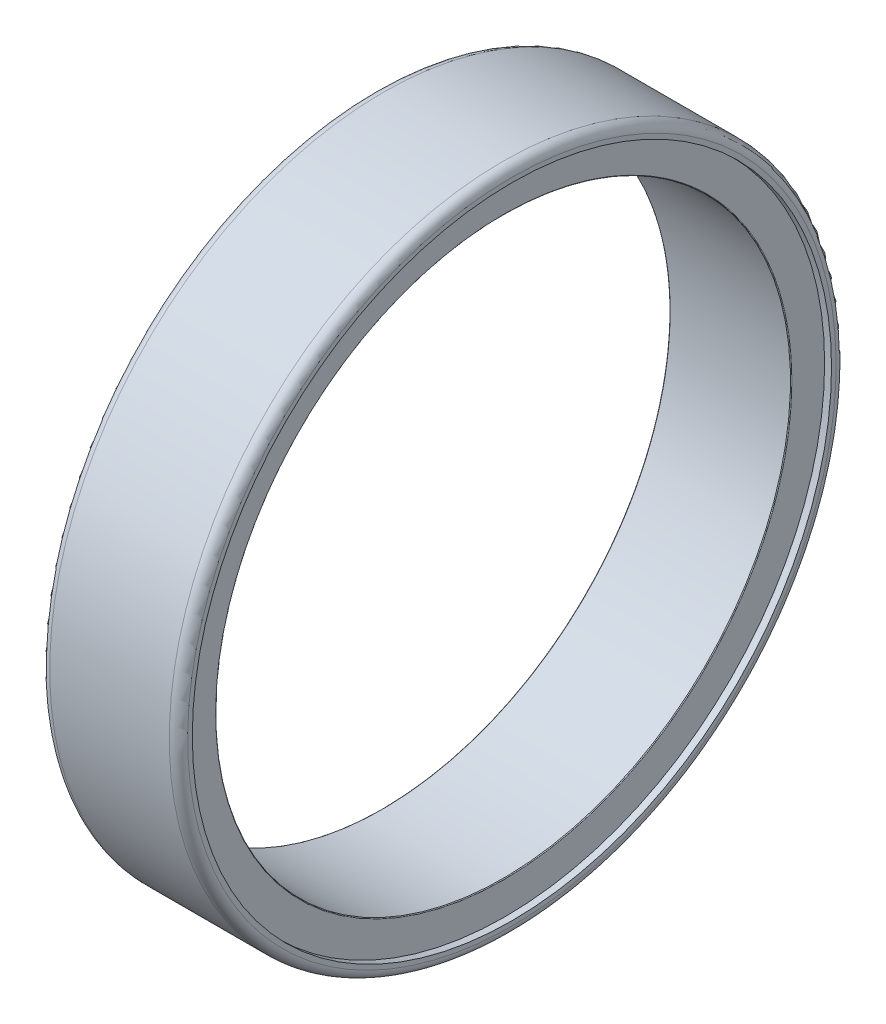
ISO-10303-21;
HEADER;
FILE_DESCRIPTION(('STEP AP214'),'2;1');
FILE_NAME('part.step','',(''),(''),'','','');
FILE_SCHEMA(('AUTOMOTIVE_DESIGN { 1 0 10303 214 1 1 1 1 }'));
ENDSEC;
DATA;
#1=APPLICATION_CONTEXT('core data for automotive mechanical design processes');
#2=APPLICATION_PROTOCOL_DEFINITION('international standard','automotive_design',2000,#1);
#3=PRODUCT_CONTEXT('',#1,'mechanical');
#4=PRODUCT('Part','Part','',(#3));
#5=PRODUCT_RELATED_PRODUCT_CATEGORY('part','',(#4));
#6=PRODUCT_DEFINITION_FORMATION('','',#4);
#7=PRODUCT_DEFINITION_CONTEXT('part definition',#1,'design');
#8=PRODUCT_DEFINITION('design','',#6,#7);
#9=PRODUCT_DEFINITION_SHAPE('','',#8);
#10=(LENGTH_UNIT() NAMED_UNIT(*) SI_UNIT(.MILLI.,.METRE.));
#11=(NAMED_UNIT(*) PLANE_ANGLE_UNIT() SI_UNIT($,.RADIAN.));
#12=(NAMED_UNIT(*) SI_UNIT($,.STERADIAN.) SOLID_ANGLE_UNIT());
#13=UNCERTAINTY_MEASURE_WITH_UNIT(LENGTH_MEASURE(1.E-05),#10,'distance_accuracy_value','');
#14=(GEOMETRIC_REPRESENTATION_CONTEXT(3) GLOBAL_UNCERTAINTY_ASSIGNED_CONTEXT((#13)) GLOBAL_UNIT_ASSIGNED_CONTEXT((#10,
#11,#12)) REPRESENTATION_CONTEXT('',''));
#15=CARTESIAN_POINT('',(0.,0.,0.));
#16=DIRECTION('',(0.,0.,1.));
#17=DIRECTION('',(1.,0.,0.));
#18=AXIS2_PLACEMENT_3D('',#15,#16,#17);
#19=CARTESIAN_POINT('',(-31.75,-1.06966278920977E-13,0.));
#20=DIRECTION('',(1.,0.,0.));
#21=DIRECTION('',(0.,1.,0.));
#22=AXIS2_PLACEMENT_3D('',#19,#20,#21);
#23=CYLINDRICAL_SURFACE('',#22,28.2);
#24=CARTESIAN_POINT('',(5.40000000000006,0.,0.));
#25=DIRECTION('',(1.,0.,0.));
#26=DIRECTION('',(0.,1.,0.));
#27=AXIS2_PLACEMENT_3D('',#24,#25,#26);
#28=CIRCLE('',#27,28.2000000000001);
#29=CARTESIAN_POINT('',(5.40000000000001,28.2,0.));
#30=VERTEX_POINT('',#29);
#31=EDGE_CURVE('E66',#30,#30,#28,.T.);
#32=ORIENTED_EDGE('',*,*,#31,.T.);
#33=EDGE_LOOP('',(#32));
#34=FACE_BOUND('',#33,.T.);
#35=CARTESIAN_POINT('',(5.23925120224264,0.,0.));
#36=DIRECTION('',(-1.,0.,0.));
#37=DIRECTION('',(0.,0.,1.));
#38=AXIS2_PLACEMENT_3D('',#35,#36,#37);
#39=CIRCLE('',#38,28.2);
#40=CARTESIAN_POINT('',(5.23925120224264,0.,28.2));
#41=VERTEX_POINT('',#40);
#42=EDGE_CURVE('E35',#41,#41,#39,.T.);
#43=ORIENTED_EDGE('',*,*,#42,.T.);
#44=EDGE_LOOP('',(#43));
#45=FACE_BOUND('',#44,.T.);
#46=ADVANCED_FACE('F31',(#34,#45),#23,.F.);
#47=CARTESIAN_POINT('',(-5.39999999999994,0.,0.));
#48=DIRECTION('',(1.,0.,0.));
#49=DIRECTION('',(0.,1.,0.));
#50=AXIS2_PLACEMENT_3D('',#47,#48,#49);
#51=CIRCLE('',#50,28.2);
#52=CARTESIAN_POINT('',(-5.39999999999999,28.2,0.));
#53=VERTEX_POINT('',#52);
#54=EDGE_CURVE('E53',#53,#53,#51,.T.);
#55=ORIENTED_EDGE('',*,*,#54,.F.);
#56=EDGE_LOOP('',(#55));
#57=FACE_BOUND('',#56,.T.);
#58=CARTESIAN_POINT('',(-5.23925120224265,0.,0.));
#59=DIRECTION('',(1.,0.,0.));
#60=DIRECTION('',(0.,0.,-1.));
#61=AXIS2_PLACEMENT_3D('',#58,#59,#60);
#62=CIRCLE('',#61,28.2);
#63=CARTESIAN_POINT('',(-5.23925120224265,0.,-28.2));
#64=VERTEX_POINT('',#63);
#65=EDGE_CURVE('E47',#64,#64,#62,.T.);
#66=ORIENTED_EDGE('',*,*,#65,.T.);
#67=EDGE_LOOP('',(#66));
#68=FACE_BOUND('',#67,.T.);
#69=ADVANCED_FACE('F101',(#57,#68),#23,.F.);
#70=CARTESIAN_POINT('',(-5.39999999999999,28.2,0.));
#71=DIRECTION('',(1.,0.,0.));
#72=DIRECTION('',(0.,1.,0.));
#73=AXIS2_PLACEMENT_3D('',#70,#71,#72);
#74=PLANE('',#73);
#75=ORIENTED_EDGE('',*,*,#54,.T.);
#76=EDGE_LOOP('',(#75));
#77=FACE_BOUND('',#76,.T.);
#78=CARTESIAN_POINT('',(-5.39999999999994,0.,0.));
#79=DIRECTION('',(1.,0.,0.));
#80=DIRECTION('',(0.,1.,0.));
#81=AXIS2_PLACEMENT_3D('',#78,#79,#80);
#82=CIRCLE('',#81,27.8);
#83=CARTESIAN_POINT('',(-5.39999999999999,27.8,0.));
#84=VERTEX_POINT('',#83);
#85=EDGE_CURVE('E10',#84,#84,#82,.T.);
#86=ORIENTED_EDGE('',*,*,#85,.F.);
#87=EDGE_LOOP('',(#86));
#88=FACE_BOUND('',#87,.T.);
#89=ADVANCED_FACE('F33',(#77,#88),#74,.T.);
#90=CARTESIAN_POINT('',(-31.75,-1.06966278920977E-13,0.));
#91=DIRECTION('',(1.,0.,0.));
#92=DIRECTION('',(0.,1.,0.));
#93=AXIS2_PLACEMENT_3D('',#90,#91,#92);
#94=CYLINDRICAL_SURFACE('',#93,27.8);
#95=ORIENTED_EDGE('',*,*,#85,.T.);
#96=EDGE_LOOP('',(#95));
#97=FACE_BOUND('',#96,.T.);
#98=CARTESIAN_POINT('',(-5.99999999999994,0.,0.));
#99=DIRECTION('',(1.,0.,0.));
#100=DIRECTION('',(0.,1.,0.));
#101=AXIS2_PLACEMENT_3D('',#98,#99,#100);
#102=CIRCLE('',#101,27.8);
#103=CARTESIAN_POINT('',(-5.99999999999999,27.8,0.));
#104=VERTEX_POINT('',#103);
#105=EDGE_CURVE('E39',#104,#104,#102,.T.);
#106=ORIENTED_EDGE('',*,*,#105,.F.);
#107=EDGE_LOOP('',(#106));
#108=FACE_BOUND('',#107,.T.);
#109=ADVANCED_FACE('F91',(#97,#108),#94,.F.);
#110=CARTESIAN_POINT('',(-5.99999999999999,27.8,0.));
#111=DIRECTION('',(-1.,0.,0.));
#112=DIRECTION('',(0.,-1.,0.));
#113=AXIS2_PLACEMENT_3D('',#110,#111,#112);
#114=PLANE('',#113);
#115=ORIENTED_EDGE('',*,*,#105,.T.);
#116=EDGE_LOOP('',(#115));
#117=FACE_BOUND('',#116,.T.);
#118=CARTESIAN_POINT('',(-5.99999999999994,0.,0.));
#119=DIRECTION('',(1.,0.,0.));
#120=DIRECTION('',(0.,1.,0.));
#121=AXIS2_PLACEMENT_3D('',#118,#119,#120);
#122=CIRCLE('',#121,28.2);
#123=CARTESIAN_POINT('',(-5.99999999999999,28.2,0.));
#124=VERTEX_POINT('',#123);
#125=EDGE_CURVE('E44',#124,#124,#122,.T.);
#126=ORIENTED_EDGE('',*,*,#125,.F.);
#127=EDGE_LOOP('',(#126));
#128=FACE_BOUND('',#127,.T.);
#129=ADVANCED_FACE('F89',(#117,#128),#114,.T.);
#130=CARTESIAN_POINT('',(-5.19999999999994,0.,0.));
#131=DIRECTION('',(1.,0.,0.));
#132=DIRECTION('',(0.,1.,0.));
#133=AXIS2_PLACEMENT_3D('',#130,#131,#132);
#134=TOROIDAL_SURFACE('',#133,28.2,0.800000000000001);
#135=ORIENTED_EDGE('',*,*,#125,.T.);
#136=EDGE_LOOP('',(#135));
#137=FACE_BOUND('',#136,.T.);
#138=CARTESIAN_POINT('',(-5.19999999999993,0.,0.));
#139=DIRECTION('',(1.,0.,0.));
#140=DIRECTION('',(0.,1.,0.));
#141=AXIS2_PLACEMENT_3D('',#138,#139,#140);
#142=CIRCLE('',#141,29.);
#143=CARTESIAN_POINT('',(-5.19999999999999,29.,0.));
#144=VERTEX_POINT('',#143);
#145=EDGE_CURVE('E81',#144,#144,#142,.T.);
#146=ORIENTED_EDGE('',*,*,#145,.F.);
#147=EDGE_LOOP('',(#146));
#148=FACE_BOUND('',#147,.T.);
#149=ADVANCED_FACE('F86',(#137,#148),#134,.T.);
#150=CARTESIAN_POINT('',(-31.75,-1.06966278920977E-13,0.));
#151=DIRECTION('',(1.,0.,0.));
#152=DIRECTION('',(0.,1.,0.));
#153=AXIS2_PLACEMENT_3D('',#150,#151,#152);
#154=CYLINDRICAL_SURFACE('',#153,29.);
#155=ORIENTED_EDGE('',*,*,#145,.T.);
#156=EDGE_LOOP('',(#155));
#157=FACE_BOUND('',#156,.T.);
#158=CARTESIAN_POINT('',(5.20000000000006,0.,0.));
#159=DIRECTION('',(1.,0.,0.));
#160=DIRECTION('',(0.,1.,0.));
#161=AXIS2_PLACEMENT_3D('',#158,#159,#160);
#162=CIRCLE('',#161,29.0000000000001);
#163=CARTESIAN_POINT('',(5.2,29.,0.));
#164=VERTEX_POINT('',#163);
#165=EDGE_CURVE('E78',#164,#164,#162,.T.);
#166=ORIENTED_EDGE('',*,*,#165,.F.);
#167=EDGE_LOOP('',(#166));
#168=FACE_BOUND('',#167,.T.);
#169=ADVANCED_FACE('F98',(#157,#168),#154,.T.);
#170=CARTESIAN_POINT('',(5.20000000000006,0.,0.));
#171=DIRECTION('',(1.,0.,0.));
#172=DIRECTION('',(0.,1.,0.));
#173=AXIS2_PLACEMENT_3D('',#170,#171,#172);
#174=TOROIDAL_SURFACE('',#173,28.2000000000001,0.800000000000002);
#175=ORIENTED_EDGE('',*,*,#165,.T.);
#176=EDGE_LOOP('',(#175));
#177=FACE_BOUND('',#176,.T.);
#178=CARTESIAN_POINT('',(6.00000000000007,0.,0.));
#179=DIRECTION('',(1.,0.,0.));
#180=DIRECTION('',(0.,1.,0.));
#181=AXIS2_PLACEMENT_3D('',#178,#179,#180);
#182=CIRCLE('',#181,28.2000000000001);
#183=CARTESIAN_POINT('',(6.00000000000002,28.2,0.));
#184=VERTEX_POINT('',#183);
#185=EDGE_CURVE('E75',#184,#184,#182,.T.);
#186=ORIENTED_EDGE('',*,*,#185,.F.);
#187=EDGE_LOOP('',(#186));
#188=FACE_BOUND('',#187,.T.);
#189=ADVANCED_FACE('F124',(#177,#188),#174,.T.);
#190=CARTESIAN_POINT('',(6.00000000000001,28.2,0.));
#191=DIRECTION('',(1.,0.,0.));
#192=DIRECTION('',(0.,1.,0.));
#193=AXIS2_PLACEMENT_3D('',#190,#191,#192);
#194=PLANE('',#193);
#195=ORIENTED_EDGE('',*,*,#185,.T.);
#196=EDGE_LOOP('',(#195));
#197=FACE_BOUND('',#196,.T.);
#198=CARTESIAN_POINT('',(6.00000000000005,0.,0.));
#199=DIRECTION('',(1.,0.,0.));
#200=DIRECTION('',(0.,1.,0.));
#201=AXIS2_PLACEMENT_3D('',#198,#199,#200);
#202=CIRCLE('',#201,27.8000000000001);
#203=CARTESIAN_POINT('',(6.,27.8,0.));
#204=VERTEX_POINT('',#203);
#205=EDGE_CURVE('E72',#204,#204,#202,.T.);
#206=ORIENTED_EDGE('',*,*,#205,.F.);
#207=EDGE_LOOP('',(#206));
#208=FACE_BOUND('',#207,.T.);
#209=ADVANCED_FACE('F120',(#197,#208),#194,.T.);
#210=CARTESIAN_POINT('',(-31.75,-1.06966278920977E-13,0.));
#211=DIRECTION('',(1.,0.,0.));
#212=DIRECTION('',(0.,1.,0.));
#213=AXIS2_PLACEMENT_3D('',#210,#211,#212);
#214=CYLINDRICAL_SURFACE('',#213,27.8000000000001);
#215=ORIENTED_EDGE('',*,*,#205,.T.);
#216=EDGE_LOOP('',(#215));
#217=FACE_BOUND('',#216,.T.);
#218=CARTESIAN_POINT('',(5.40000000000006,0.,0.));
#219=DIRECTION('',(1.,0.,0.));
#220=DIRECTION('',(0.,1.,0.));
#221=AXIS2_PLACEMENT_3D('',#218,#219,#220);
#222=CIRCLE('',#221,27.8000000000001);
#223=CARTESIAN_POINT('',(5.40000000000001,27.8,0.));
#224=VERTEX_POINT('',#223);
#225=EDGE_CURVE('E69',#224,#224,#222,.T.);
#226=ORIENTED_EDGE('',*,*,#225,.F.);
#227=EDGE_LOOP('',(#226));
#228=FACE_BOUND('',#227,.T.);
#229=ADVANCED_FACE('F116',(#217,#228),#214,.F.);
#230=CARTESIAN_POINT('',(5.40000000000001,27.8,0.));
#231=DIRECTION('',(-1.,0.,0.));
#232=DIRECTION('',(0.,-1.,0.));
#233=AXIS2_PLACEMENT_3D('',#230,#231,#232);
#234=PLANE('',#233);
#235=ORIENTED_EDGE('',*,*,#225,.T.);
#236=EDGE_LOOP('',(#235));
#237=FACE_BOUND('',#236,.T.);
#238=ORIENTED_EDGE('',*,*,#31,.F.);
#239=EDGE_LOOP('',(#238));
#240=FACE_BOUND('',#239,.T.);
#241=ADVANCED_FACE('F113',(#237,#240),#234,.T.);
#242=CARTESIAN_POINT('',(-5.22798,0.,0.));
#243=DIRECTION('',(-1.,0.,0.));
#244=DIRECTION('',(0.,0.,1.));
#245=AXIS2_PLACEMENT_3D('',#242,#243,#244);
#246=TOROIDAL_SURFACE('',#245,25.06402,0.064020000000001);
#247=CARTESIAN_POINT('',(-5.22798,0.,0.));
#248=DIRECTION('',(-1.,0.,0.));
#249=DIRECTION('',(0.,0.,1.));
#250=AXIS2_PLACEMENT_3D('',#247,#248,#249);
#251=CIRCLE('',#250,25.);
#252=CARTESIAN_POINT('',(-5.22798,0.,25.));
#253=VERTEX_POINT('',#252);
#254=EDGE_CURVE('E49',#253,#253,#251,.T.);
#255=ORIENTED_EDGE('',*,*,#254,.F.);
#256=EDGE_LOOP('',(#255));
#257=FACE_BOUND('',#256,.T.);
#258=CARTESIAN_POINT('',(-5.29200000000001,0.,0.));
#259=DIRECTION('',(-1.,0.,0.));
#260=DIRECTION('',(0.,0.,1.));
#261=AXIS2_PLACEMENT_3D('',#258,#259,#260);
#262=CIRCLE('',#261,25.06402);
#263=CARTESIAN_POINT('',(-5.29200000000001,0.,25.06402));
#264=VERTEX_POINT('',#263);
#265=EDGE_CURVE('E278',#264,#264,#262,.T.);
#266=ORIENTED_EDGE('',*,*,#265,.T.);
#267=EDGE_LOOP('',(#266));
#268=FACE_BOUND('',#267,.T.);
#269=ADVANCED_FACE('F111',(#257,#268),#246,.T.);
#270=CARTESIAN_POINT('',(-25.4,0.,0.));
#271=DIRECTION('',(-1.,0.,0.));
#272=DIRECTION('',(0.,0.,1.));
#273=AXIS2_PLACEMENT_3D('',#270,#271,#272);
#274=CYLINDRICAL_SURFACE('',#273,25.);
#275=CARTESIAN_POINT('',(5.22798,0.,0.));
#276=DIRECTION('',(-1.,0.,0.));
#277=DIRECTION('',(0.,0.,1.));
#278=AXIS2_PLACEMENT_3D('',#275,#276,#277);
#279=CIRCLE('',#278,25.);
#280=CARTESIAN_POINT('',(5.22798,0.,25.));
#281=VERTEX_POINT('',#280);
#282=EDGE_CURVE('E55',#281,#281,#279,.T.);
#283=ORIENTED_EDGE('',*,*,#282,.F.);
#284=EDGE_LOOP('',(#283));
#285=FACE_BOUND('',#284,.T.);
#286=ORIENTED_EDGE('',*,*,#254,.T.);
#287=EDGE_LOOP('',(#286));
#288=FACE_BOUND('',#287,.T.);
#289=ADVANCED_FACE('F168',(#285,#288),#274,.F.);
#290=CARTESIAN_POINT('',(5.22798,0.,0.));
#291=DIRECTION('',(-1.,0.,0.));
#292=DIRECTION('',(0.,0.,1.));
#293=AXIS2_PLACEMENT_3D('',#290,#291,#292);
#294=TOROIDAL_SURFACE('',#293,25.06402,0.0640200000000006);
#295=CARTESIAN_POINT('',(5.292,0.,0.));
#296=DIRECTION('',(-1.,0.,0.));
#297=DIRECTION('',(0.,0.,1.));
#298=AXIS2_PLACEMENT_3D('',#295,#296,#297);
#299=CIRCLE('',#298,25.06402);
#300=CARTESIAN_POINT('',(5.292,0.,25.06402));
#301=VERTEX_POINT('',#300);
#302=EDGE_CURVE('E60',#301,#301,#299,.T.);
#303=ORIENTED_EDGE('',*,*,#302,.F.);
#304=EDGE_LOOP('',(#303));
#305=FACE_BOUND('',#304,.T.);
#306=ORIENTED_EDGE('',*,*,#282,.T.);
#307=EDGE_LOOP('',(#306));
#308=FACE_BOUND('',#307,.T.);
#309=ADVANCED_FACE('F176',(#305,#308),#294,.T.);
#310=CARTESIAN_POINT('',(5.292,28.13698,0.));
#311=DIRECTION('',(-1.,0.,0.));
#312=DIRECTION('',(0.,0.,1.));
#313=AXIS2_PLACEMENT_3D('',#310,#311,#312);
#314=PLANE('',#313);
#315=CARTESIAN_POINT('',(5.292,0.,0.));
#316=DIRECTION('',(-1.,0.,0.));
#317=DIRECTION('',(0.,0.,1.));
#318=AXIS2_PLACEMENT_3D('',#315,#316,#317);
#319=CIRCLE('',#318,28.13698);
#320=CARTESIAN_POINT('',(5.292,0.,28.13698));
#321=VERTEX_POINT('',#320);
#322=EDGE_CURVE('E283',#321,#321,#319,.T.);
#323=ORIENTED_EDGE('',*,*,#322,.F.);
#324=EDGE_LOOP('',(#323));
#325=FACE_BOUND('',#324,.T.);
#326=ORIENTED_EDGE('',*,*,#302,.T.);
#327=EDGE_LOOP('',(#326));
#328=FACE_BOUND('',#327,.T.);
#329=ADVANCED_FACE('F183',(#325,#328),#314,.F.);
#330=CARTESIAN_POINT('',(5.22798,0.,0.));
#331=DIRECTION('',(-1.,0.,0.));
#332=DIRECTION('',(0.,0.,1.));
#333=AXIS2_PLACEMENT_3D('',#330,#331,#332);
#334=TOROIDAL_SURFACE('',#333,28.13698,0.0640200000000019);
#335=ORIENTED_EDGE('',*,*,#42,.F.);
#336=EDGE_LOOP('',(#335));
#337=FACE_BOUND('',#336,.T.);
#338=ORIENTED_EDGE('',*,*,#322,.T.);
#339=EDGE_LOOP('',(#338));
#340=FACE_BOUND('',#339,.T.);
#341=ADVANCED_FACE('F191',(#337,#340),#334,.T.);
#342=CARTESIAN_POINT('',(-5.22798,0.,0.));
#343=DIRECTION('',(-1.,0.,0.));
#344=DIRECTION('',(0.,0.,1.));
#345=AXIS2_PLACEMENT_3D('',#342,#343,#344);
#346=TOROIDAL_SURFACE('',#345,28.13698,0.0640200000000023);
#347=ORIENTED_EDGE('',*,*,#65,.F.);
#348=EDGE_LOOP('',(#347));
#349=FACE_BOUND('',#348,.T.);
#350=CARTESIAN_POINT('',(-5.29200000000001,0.,0.));
#351=DIRECTION('',(-1.,0.,0.));
#352=DIRECTION('',(0.,0.,1.));
#353=AXIS2_PLACEMENT_3D('',#350,#351,#352);
#354=CIRCLE('',#353,28.13698);
#355=CARTESIAN_POINT('',(-5.29200000000001,0.,28.13698));
#356=VERTEX_POINT('',#355);
#357=EDGE_CURVE('E281',#356,#356,#354,.T.);
#358=ORIENTED_EDGE('',*,*,#357,.F.);
#359=EDGE_LOOP('',(#358));
#360=FACE_BOUND('',#359,.T.);
#361=ADVANCED_FACE('F199',(#349,#360),#346,.T.);
#362=CARTESIAN_POINT('',(-5.292,28.13698,0.));
#363=DIRECTION('',(1.,0.,0.));
#364=DIRECTION('',(0.,0.,-1.));
#365=AXIS2_PLACEMENT_3D('',#362,#363,#364);
#366=PLANE('',#365);
#367=ORIENTED_EDGE('',*,*,#265,.F.);
#368=EDGE_LOOP('',(#367));
#369=FACE_BOUND('',#368,.T.);
#370=ORIENTED_EDGE('',*,*,#357,.T.);
#371=EDGE_LOOP('',(#370));
#372=FACE_BOUND('',#371,.T.);
#373=ADVANCED_FACE('F207',(#369,#372),#366,.F.);
#374=CLOSED_SHELL('',(#46,#69,#89,#109,#129,#149,#169,#189,#209,#229,#241,#269,#289,#309,#329,
#341,#361,#373));
#375=MANIFOLD_SOLID_BREP('B2',#374);
#376=ADVANCED_BREP_SHAPE_REPRESENTATION('',(#18,#375),#14);
#377=SHAPE_DEFINITION_REPRESENTATION(#9,#376);
ENDSEC;
END-ISO-10303-21;
